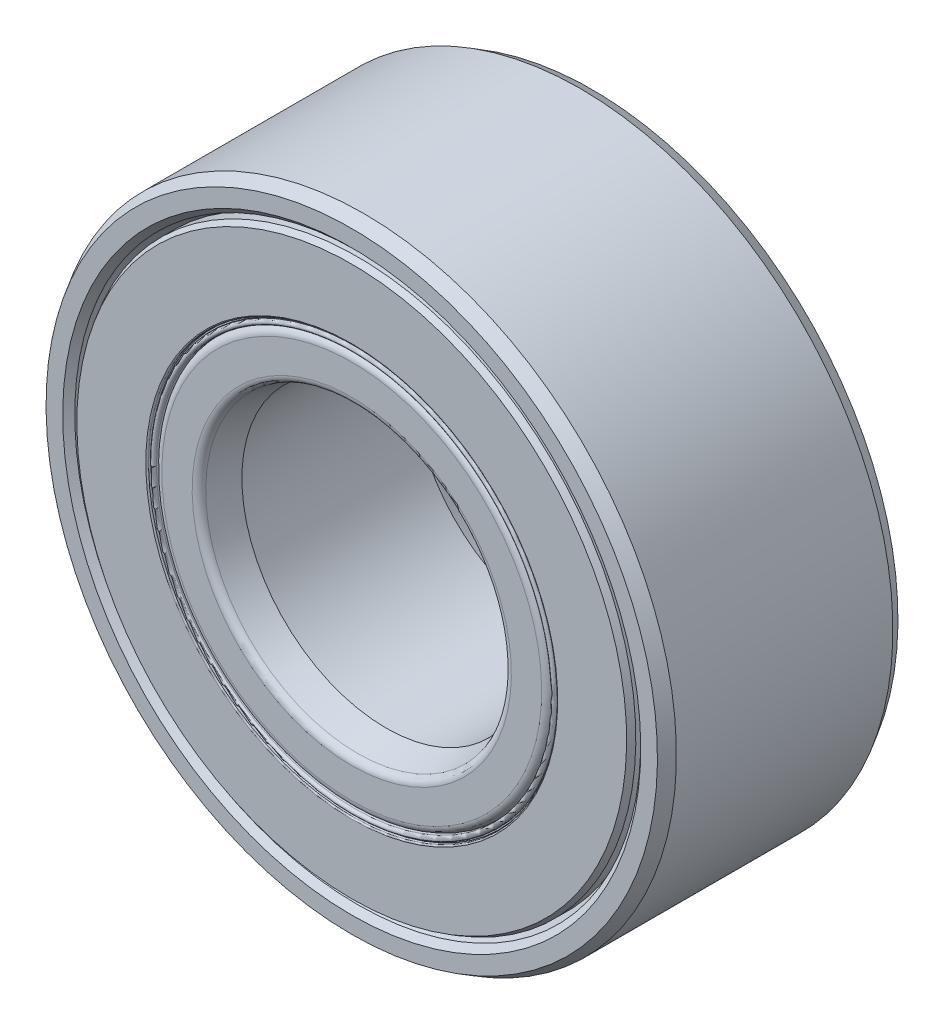
ISO-10303-21;
HEADER;
FILE_DESCRIPTION(('STEP AP214'),'2;1');
FILE_NAME('part.step','',(''),(''),'','','');
FILE_SCHEMA(('AUTOMOTIVE_DESIGN { 1 0 10303 214 1 1 1 1 }'));
ENDSEC;
DATA;
#1=APPLICATION_CONTEXT('core data for automotive mechanical design processes');
#2=APPLICATION_PROTOCOL_DEFINITION('international standard','automotive_design',2000,#1);
#3=PRODUCT_CONTEXT('',#1,'mechanical');
#4=PRODUCT('Part','Part','',(#3));
#5=PRODUCT_RELATED_PRODUCT_CATEGORY('part','',(#4));
#6=PRODUCT_DEFINITION_FORMATION('','',#4);
#7=PRODUCT_DEFINITION_CONTEXT('part definition',#1,'design');
#8=PRODUCT_DEFINITION('design','',#6,#7);
#9=PRODUCT_DEFINITION_SHAPE('','',#8);
#10=(LENGTH_UNIT() NAMED_UNIT(*) SI_UNIT(.MILLI.,.METRE.));
#11=(NAMED_UNIT(*) PLANE_ANGLE_UNIT() SI_UNIT($,.RADIAN.));
#12=(NAMED_UNIT(*) SI_UNIT($,.STERADIAN.) SOLID_ANGLE_UNIT());
#13=UNCERTAINTY_MEASURE_WITH_UNIT(LENGTH_MEASURE(1.E-05),#10,'distance_accuracy_value','');
#14=(GEOMETRIC_REPRESENTATION_CONTEXT(3) GLOBAL_UNCERTAINTY_ASSIGNED_CONTEXT((#13)) GLOBAL_UNIT_ASSIGNED_CONTEXT((#10,
#11,#12)) REPRESENTATION_CONTEXT('',''));
#15=CARTESIAN_POINT('',(0.,0.,0.));
#16=DIRECTION('',(0.,0.,1.));
#17=DIRECTION('',(1.,0.,0.));
#18=AXIS2_PLACEMENT_3D('',#15,#16,#17);
#19=CARTESIAN_POINT('',(0.,4.11333333333333,1.3125));
#20=DIRECTION('',(0.,0.,1.));
#21=DIRECTION('',(0.,-1.,0.));
#22=AXIS2_PLACEMENT_3D('',#19,#20,#21);
#23=PLANE('',#22);
#24=CARTESIAN_POINT('',(0.,0.,1.3125));
#25=DIRECTION('',(0.,0.,1.));
#26=DIRECTION('',(0.,-1.,0.));
#27=AXIS2_PLACEMENT_3D('',#24,#25,#26);
#28=CIRCLE('',#27,4.25333333333333);
#29=CARTESIAN_POINT('',(0.,-4.25333333333333,1.3125));
#30=VERTEX_POINT('',#29);
#31=EDGE_CURVE('E11',#30,#30,#28,.T.);
#32=ORIENTED_EDGE('',*,*,#31,.F.);
#33=EDGE_LOOP('',(#32));
#34=FACE_BOUND('',#33,.T.);
#35=CARTESIAN_POINT('',(0.,0.,1.3125));
#36=DIRECTION('',(0.,0.,1.));
#37=DIRECTION('',(0.,-1.,0.));
#38=AXIS2_PLACEMENT_3D('',#35,#36,#37);
#39=CIRCLE('',#38,4.11333333333333);
#40=CARTESIAN_POINT('',(0.,-4.11333333333333,1.3125));
#41=VERTEX_POINT('',#40);
#42=EDGE_CURVE('E71',#41,#41,#39,.T.);
#43=ORIENTED_EDGE('',*,*,#42,.T.);
#44=EDGE_LOOP('',(#43));
#45=FACE_BOUND('',#44,.T.);
#46=ADVANCED_FACE('F46',(#34,#45),#23,.F.);
#47=CARTESIAN_POINT('',(0.,0.,2.5));
#48=DIRECTION('',(0.,0.,1.));
#49=DIRECTION('',(0.,-1.,0.));
#50=AXIS2_PLACEMENT_3D('',#47,#48,#49);
#51=CYLINDRICAL_SURFACE('',#50,4.25333333333333);
#52=CARTESIAN_POINT('',(0.,0.,2.39056210322341));
#53=DIRECTION('',(0.,0.,1.));
#54=DIRECTION('',(0.,-1.,0.));
#55=AXIS2_PLACEMENT_3D('',#52,#53,#54);
#56=CIRCLE('',#55,4.25333333333333);
#57=CARTESIAN_POINT('',(0.,-4.25333333333333,2.39056210322341));
#58=VERTEX_POINT('',#57);
#59=EDGE_CURVE('E52',#58,#58,#56,.T.);
#60=ORIENTED_EDGE('',*,*,#59,.F.);
#61=EDGE_LOOP('',(#60));
#62=FACE_BOUND('',#61,.T.);
#63=ORIENTED_EDGE('',*,*,#31,.T.);
#64=EDGE_LOOP('',(#63));
#65=FACE_BOUND('',#64,.T.);
#66=ADVANCED_FACE('F102',(#62,#65),#51,.T.);
#67=CARTESIAN_POINT('',(0.,0.,2.39056210322341));
#68=DIRECTION('',(0.,0.,-1.));
#69=DIRECTION('',(0.,1.,0.));
#70=AXIS2_PLACEMENT_3D('',#67,#68,#69);
#71=CONICAL_SURFACE('',#70,4.25333333333333,0.174532925199437);
#72=CARTESIAN_POINT('',(0.,0.,2.42503037457884));
#73=DIRECTION('',(0.,0.,1.));
#74=DIRECTION('',(0.,-1.,0.));
#75=AXIS2_PLACEMENT_3D('',#72,#73,#74);
#76=CIRCLE('',#75,4.24725564711499);
#77=CARTESIAN_POINT('',(0.,-4.24725564711499,2.42503037457884));
#78=VERTEX_POINT('',#77);
#79=EDGE_CURVE('E56',#78,#78,#76,.T.);
#80=ORIENTED_EDGE('',*,*,#79,.F.);
#81=EDGE_LOOP('',(#80));
#82=FACE_BOUND('',#81,.T.);
#83=ORIENTED_EDGE('',*,*,#59,.T.);
#84=EDGE_LOOP('',(#83));
#85=FACE_BOUND('',#84,.T.);
#86=ADVANCED_FACE('F97',(#82,#85),#71,.T.);
#87=CARTESIAN_POINT('',(0.,0.,2.4225));
#88=DIRECTION('',(0.,0.,1.));
#89=DIRECTION('',(0.,-1.,0.));
#90=AXIS2_PLACEMENT_3D('',#87,#88,#89);
#91=TOROIDAL_SURFACE('',#90,4.23290517976922,0.0145718464358899);
#92=CARTESIAN_POINT('',(0.,0.,2.4225));
#93=DIRECTION('',(0.,0.,1.));
#94=DIRECTION('',(0.,-1.,0.));
#95=AXIS2_PLACEMENT_3D('',#92,#93,#94);
#96=CIRCLE('',#95,4.21833333333333);
#97=CARTESIAN_POINT('',(0.,-4.21833333333333,2.4225));
#98=VERTEX_POINT('',#97);
#99=EDGE_CURVE('E60',#98,#98,#96,.T.);
#100=ORIENTED_EDGE('',*,*,#99,.F.);
#101=EDGE_LOOP('',(#100));
#102=FACE_BOUND('',#101,.T.);
#103=ORIENTED_EDGE('',*,*,#79,.T.);
#104=EDGE_LOOP('',(#103));
#105=FACE_BOUND('',#104,.T.);
#106=ADVANCED_FACE('F91',(#102,#105),#91,.T.);
#107=CARTESIAN_POINT('',(0.,0.,2.5));
#108=DIRECTION('',(0.,0.,1.));
#109=DIRECTION('',(0.,-1.,0.));
#110=AXIS2_PLACEMENT_3D('',#107,#108,#109);
#111=CYLINDRICAL_SURFACE('',#110,4.21833333333333);
#112=CARTESIAN_POINT('',(0.,0.,2.4475));
#113=DIRECTION('',(0.,0.,1.));
#114=DIRECTION('',(0.,-1.,0.));
#115=AXIS2_PLACEMENT_3D('',#112,#113,#114);
#116=CIRCLE('',#115,4.21833333333333);
#117=CARTESIAN_POINT('',(0.,-4.21833333333333,2.4475));
#118=VERTEX_POINT('',#117);
#119=EDGE_CURVE('E65',#118,#118,#116,.T.);
#120=ORIENTED_EDGE('',*,*,#119,.F.);
#121=EDGE_LOOP('',(#120));
#122=FACE_BOUND('',#121,.T.);
#123=ORIENTED_EDGE('',*,*,#99,.T.);
#124=EDGE_LOOP('',(#123));
#125=FACE_BOUND('',#124,.T.);
#126=ADVANCED_FACE('F85',(#122,#125),#111,.T.);
#127=CARTESIAN_POINT('',(0.,0.,2.4475));
#128=DIRECTION('',(0.,0.,1.));
#129=DIRECTION('',(0.,-1.,0.));
#130=AXIS2_PLACEMENT_3D('',#127,#128,#129);
#131=TOROIDAL_SURFACE('',#130,4.16583333333333,0.0525000000000009);
#132=CARTESIAN_POINT('',(0.,0.,2.4475));
#133=DIRECTION('',(0.,0.,1.));
#134=DIRECTION('',(0.,-1.,0.));
#135=AXIS2_PLACEMENT_3D('',#132,#133,#134);
#136=CIRCLE('',#135,4.11333333333333);
#137=CARTESIAN_POINT('',(0.,-4.11333333333333,2.4475));
#138=VERTEX_POINT('',#137);
#139=EDGE_CURVE('E68',#138,#138,#136,.T.);
#140=ORIENTED_EDGE('',*,*,#139,.F.);
#141=EDGE_LOOP('',(#140));
#142=FACE_BOUND('',#141,.T.);
#143=ORIENTED_EDGE('',*,*,#119,.T.);
#144=EDGE_LOOP('',(#143));
#145=FACE_BOUND('',#144,.T.);
#146=ADVANCED_FACE('F79',(#142,#145),#131,.T.);
#147=CARTESIAN_POINT('',(0.,0.,2.5));
#148=DIRECTION('',(0.,0.,1.));
#149=DIRECTION('',(0.,-1.,0.));
#150=AXIS2_PLACEMENT_3D('',#147,#148,#149);
#151=CYLINDRICAL_SURFACE('',#150,4.11333333333333);
#152=ORIENTED_EDGE('',*,*,#42,.F.);
#153=EDGE_LOOP('',(#152));
#154=FACE_BOUND('',#153,.T.);
#155=ORIENTED_EDGE('',*,*,#139,.T.);
#156=EDGE_LOOP('',(#155));
#157=FACE_BOUND('',#156,.T.);
#158=ADVANCED_FACE('F76',(#154,#157),#151,.F.);
#159=CLOSED_SHELL('',(#46,#66,#86,#106,#126,#146,#158));
#160=MANIFOLD_SOLID_BREP('B2',#159);
#161=CARTESIAN_POINT('',(0.,0.,-2.50000000000001));
#162=DIRECTION('',(0.,0.,1.));
#163=DIRECTION('',(0.,-1.,0.));
#164=AXIS2_PLACEMENT_3D('',#161,#162,#163);
#165=CONICAL_SURFACE('',#164,5.715,0.523598775598297);
#166=CARTESIAN_POINT('',(0.,0.,-2.37875644347019));
#167=DIRECTION('',(0.,0.,1.));
#168=DIRECTION('',(0.,-1.,0.));
#169=AXIS2_PLACEMENT_3D('',#166,#167,#168);
#170=CIRCLE('',#169,5.785);
#171=CARTESIAN_POINT('',(0.,-5.785,-2.37875644347019));
#172=VERTEX_POINT('',#171);
#173=EDGE_CURVE('E169',#172,#172,#170,.T.);
#174=ORIENTED_EDGE('',*,*,#173,.F.);
#175=EDGE_LOOP('',(#174));
#176=FACE_BOUND('',#175,.T.);
#177=CARTESIAN_POINT('',(0.,0.,-2.50000000000001));
#178=DIRECTION('',(0.,0.,1.));
#179=DIRECTION('',(0.,-1.,0.));
#180=AXIS2_PLACEMENT_3D('',#177,#178,#179);
#181=CIRCLE('',#180,5.715);
#182=CARTESIAN_POINT('',(0.,-5.715,-2.50000000000001));
#183=VERTEX_POINT('',#182);
#184=EDGE_CURVE('E45',#183,#183,#181,.T.);
#185=ORIENTED_EDGE('',*,*,#184,.T.);
#186=EDGE_LOOP('',(#185));
#187=FACE_BOUND('',#186,.T.);
#188=ADVANCED_FACE('F147',(#176,#187),#165,.T.);
#189=CARTESIAN_POINT('',(0.,5.715,-2.50000000000001));
#190=DIRECTION('',(0.,0.,1.));
#191=DIRECTION('',(0.,-1.,0.));
#192=AXIS2_PLACEMENT_3D('',#189,#190,#191);
#193=PLANE('',#192);
#194=ORIENTED_EDGE('',*,*,#184,.F.);
#195=EDGE_LOOP('',(#194));
#196=FACE_BOUND('',#195,.T.);
#197=CARTESIAN_POINT('',(0.,0.,-2.50000000000001));
#198=DIRECTION('',(0.,0.,1.));
#199=DIRECTION('',(0.,-1.,0.));
#200=AXIS2_PLACEMENT_3D('',#197,#198,#199);
#201=CIRCLE('',#200,4.28133333333333);
#202=CARTESIAN_POINT('',(0.,-4.28133333333333,-2.50000000000001));
#203=VERTEX_POINT('',#202);
#204=EDGE_CURVE('E153',#203,#203,#201,.T.);
#205=ORIENTED_EDGE('',*,*,#204,.T.);
#206=EDGE_LOOP('',(#205));
#207=FACE_BOUND('',#206,.T.);
#208=ADVANCED_FACE('F176',(#196,#207),#193,.F.);
#209=CARTESIAN_POINT('',(0.,0.,-2.47200000000001));
#210=DIRECTION('',(0.,0.,1.));
#211=DIRECTION('',(0.,-1.,0.));
#212=AXIS2_PLACEMENT_3D('',#209,#210,#211);
#213=TOROIDAL_SURFACE('',#212,4.28133333333333,0.028);
#214=ORIENTED_EDGE('',*,*,#204,.F.);
#215=EDGE_LOOP('',(#214));
#216=FACE_BOUND('',#215,.T.);
#217=CARTESIAN_POINT('',(0.,0.,-2.47200000000001));
#218=DIRECTION('',(0.,0.,1.));
#219=DIRECTION('',(0.,-1.,0.));
#220=AXIS2_PLACEMENT_3D('',#217,#218,#219);
#221=CIRCLE('',#220,4.25333333333333);
#222=CARTESIAN_POINT('',(0.,-4.25333333333333,-2.47200000000001));
#223=VERTEX_POINT('',#222);
#224=EDGE_CURVE('E157',#223,#223,#221,.T.);
#225=ORIENTED_EDGE('',*,*,#224,.T.);
#226=EDGE_LOOP('',(#225));
#227=FACE_BOUND('',#226,.T.);
#228=ADVANCED_FACE('F180',(#216,#227),#213,.T.);
#229=CARTESIAN_POINT('',(0.,0.,2.5));
#230=DIRECTION('',(0.,0.,1.));
#231=DIRECTION('',(0.,-1.,0.));
#232=AXIS2_PLACEMENT_3D('',#229,#230,#231);
#233=CYLINDRICAL_SURFACE('',#232,4.25333333333333);
#234=ORIENTED_EDGE('',*,*,#224,.F.);
#235=EDGE_LOOP('',(#234));
#236=FACE_BOUND('',#235,.T.);
#237=CARTESIAN_POINT('',(0.,0.,-1.3125));
#238=DIRECTION('',(0.,0.,1.));
#239=DIRECTION('',(0.,-1.,0.));
#240=AXIS2_PLACEMENT_3D('',#237,#238,#239);
#241=CIRCLE('',#240,4.25333333333333);
#242=CARTESIAN_POINT('',(0.,-4.25333333333333,-1.3125));
#243=VERTEX_POINT('',#242);
#244=EDGE_CURVE('E161',#243,#243,#241,.T.);
#245=ORIENTED_EDGE('',*,*,#244,.T.);
#246=EDGE_LOOP('',(#245));
#247=FACE_BOUND('',#246,.T.);
#248=ADVANCED_FACE('F185',(#236,#247),#233,.F.);
#249=CARTESIAN_POINT('',(0.,5.785,-1.3125));
#250=DIRECTION('',(0.,0.,-1.));
#251=DIRECTION('',(0.,1.,0.));
#252=AXIS2_PLACEMENT_3D('',#249,#250,#251);
#253=PLANE('',#252);
#254=ORIENTED_EDGE('',*,*,#244,.F.);
#255=EDGE_LOOP('',(#254));
#256=FACE_BOUND('',#255,.T.);
#257=CARTESIAN_POINT('',(0.,0.,-1.3125));
#258=DIRECTION('',(0.,0.,1.));
#259=DIRECTION('',(0.,-1.,0.));
#260=AXIS2_PLACEMENT_3D('',#257,#258,#259);
#261=CIRCLE('',#260,5.785);
#262=CARTESIAN_POINT('',(0.,-5.785,-1.3125));
#263=VERTEX_POINT('',#262);
#264=EDGE_CURVE('E166',#263,#263,#261,.T.);
#265=ORIENTED_EDGE('',*,*,#264,.T.);
#266=EDGE_LOOP('',(#265));
#267=FACE_BOUND('',#266,.T.);
#268=ADVANCED_FACE('F191',(#256,#267),#253,.F.);
#269=CARTESIAN_POINT('',(0.,0.,2.5));
#270=DIRECTION('',(0.,0.,1.));
#271=DIRECTION('',(0.,-1.,0.));
#272=AXIS2_PLACEMENT_3D('',#269,#270,#271);
#273=CYLINDRICAL_SURFACE('',#272,5.785);
#274=ORIENTED_EDGE('',*,*,#264,.F.);
#275=EDGE_LOOP('',(#274));
#276=FACE_BOUND('',#275,.T.);
#277=ORIENTED_EDGE('',*,*,#173,.T.);
#278=EDGE_LOOP('',(#277));
#279=FACE_BOUND('',#278,.T.);
#280=ADVANCED_FACE('F173',(#276,#279),#273,.T.);
#281=CLOSED_SHELL('',(#188,#208,#228,#248,#268,#280));
#282=MANIFOLD_SOLID_BREP('B6',#281);
#283=CARTESIAN_POINT('',(0.,5.785,1.3125));
#284=DIRECTION('',(0.,0.,1.));
#285=DIRECTION('',(0.,-1.,0.));
#286=AXIS2_PLACEMENT_3D('',#283,#284,#285);
#287=PLANE('',#286);
#288=CARTESIAN_POINT('',(0.,0.,1.3125));
#289=DIRECTION('',(0.,0.,1.));
#290=DIRECTION('',(0.,-1.,0.));
#291=AXIS2_PLACEMENT_3D('',#288,#289,#290);
#292=CIRCLE('',#291,5.785);
#293=CARTESIAN_POINT('',(0.,-5.785,1.3125));
#294=VERTEX_POINT('',#293);
#295=EDGE_CURVE('E146',#294,#294,#292,.T.);
#296=ORIENTED_EDGE('',*,*,#295,.F.);
#297=EDGE_LOOP('',(#296));
#298=FACE_BOUND('',#297,.T.);
#299=CARTESIAN_POINT('',(0.,0.,1.3125));
#300=DIRECTION('',(0.,0.,1.));
#301=DIRECTION('',(0.,-1.,0.));
#302=AXIS2_PLACEMENT_3D('',#299,#300,#301);
#303=CIRCLE('',#302,4.25333333333333);
#304=CARTESIAN_POINT('',(0.,-4.25333333333333,1.3125));
#305=VERTEX_POINT('',#304);
#306=EDGE_CURVE('E255',#305,#305,#303,.T.);
#307=ORIENTED_EDGE('',*,*,#306,.T.);
#308=EDGE_LOOP('',(#307));
#309=FACE_BOUND('',#308,.T.);
#310=ADVANCED_FACE('F233',(#298,#309),#287,.F.);
#311=CARTESIAN_POINT('',(0.,0.,2.5));
#312=DIRECTION('',(0.,0.,1.));
#313=DIRECTION('',(0.,-1.,0.));
#314=AXIS2_PLACEMENT_3D('',#311,#312,#313);
#315=CYLINDRICAL_SURFACE('',#314,5.785);
#316=CARTESIAN_POINT('',(0.,0.,2.37875644347018));
#317=DIRECTION('',(0.,0.,1.));
#318=DIRECTION('',(0.,-1.,0.));
#319=AXIS2_PLACEMENT_3D('',#316,#317,#318);
#320=CIRCLE('',#319,5.785);
#321=CARTESIAN_POINT('',(0.,-5.785,2.37875644347018));
#322=VERTEX_POINT('',#321);
#323=EDGE_CURVE('E239',#322,#322,#320,.T.);
#324=ORIENTED_EDGE('',*,*,#323,.F.);
#325=EDGE_LOOP('',(#324));
#326=FACE_BOUND('',#325,.T.);
#327=ORIENTED_EDGE('',*,*,#295,.T.);
#328=EDGE_LOOP('',(#327));
#329=FACE_BOUND('',#328,.T.);
#330=ADVANCED_FACE('F280',(#326,#329),#315,.T.);
#331=CARTESIAN_POINT('',(0.,0.,2.37875644347018));
#332=DIRECTION('',(0.,0.,-1.));
#333=DIRECTION('',(0.,1.,0.));
#334=AXIS2_PLACEMENT_3D('',#331,#332,#333);
#335=CONICAL_SURFACE('',#334,5.785,0.523598775598299);
#336=CARTESIAN_POINT('',(0.,0.,2.5));
#337=DIRECTION('',(0.,0.,1.));
#338=DIRECTION('',(0.,-1.,0.));
#339=AXIS2_PLACEMENT_3D('',#336,#337,#338);
#340=CIRCLE('',#339,5.715);
#341=CARTESIAN_POINT('',(0.,-5.715,2.5));
#342=VERTEX_POINT('',#341);
#343=EDGE_CURVE('E243',#342,#342,#340,.T.);
#344=ORIENTED_EDGE('',*,*,#343,.F.);
#345=EDGE_LOOP('',(#344));
#346=FACE_BOUND('',#345,.T.);
#347=ORIENTED_EDGE('',*,*,#323,.T.);
#348=EDGE_LOOP('',(#347));
#349=FACE_BOUND('',#348,.T.);
#350=ADVANCED_FACE('F275',(#346,#349),#335,.T.);
#351=CARTESIAN_POINT('',(0.,5.715,2.5));
#352=DIRECTION('',(0.,0.,-1.));
#353=DIRECTION('',(0.,1.,0.));
#354=AXIS2_PLACEMENT_3D('',#351,#352,#353);
#355=PLANE('',#354);
#356=CARTESIAN_POINT('',(0.,0.,2.5));
#357=DIRECTION('',(0.,0.,1.));
#358=DIRECTION('',(0.,-1.,0.));
#359=AXIS2_PLACEMENT_3D('',#356,#357,#358);
#360=CIRCLE('',#359,4.28133333333333);
#361=CARTESIAN_POINT('',(0.,-4.28133333333333,2.5));
#362=VERTEX_POINT('',#361);
#363=EDGE_CURVE('E247',#362,#362,#360,.T.);
#364=ORIENTED_EDGE('',*,*,#363,.F.);
#365=EDGE_LOOP('',(#364));
#366=FACE_BOUND('',#365,.T.);
#367=ORIENTED_EDGE('',*,*,#343,.T.);
#368=EDGE_LOOP('',(#367));
#369=FACE_BOUND('',#368,.T.);
#370=ADVANCED_FACE('F269',(#366,#369),#355,.F.);
#371=CARTESIAN_POINT('',(0.,0.,2.472));
#372=DIRECTION('',(0.,0.,1.));
#373=DIRECTION('',(0.,-1.,0.));
#374=AXIS2_PLACEMENT_3D('',#371,#372,#373);
#375=TOROIDAL_SURFACE('',#374,4.28133333333333,0.028);
#376=CARTESIAN_POINT('',(0.,0.,2.472));
#377=DIRECTION('',(0.,0.,1.));
#378=DIRECTION('',(0.,-1.,0.));
#379=AXIS2_PLACEMENT_3D('',#376,#377,#378);
#380=CIRCLE('',#379,4.25333333333333);
#381=CARTESIAN_POINT('',(0.,-4.25333333333333,2.472));
#382=VERTEX_POINT('',#381);
#383=EDGE_CURVE('E252',#382,#382,#380,.T.);
#384=ORIENTED_EDGE('',*,*,#383,.F.);
#385=EDGE_LOOP('',(#384));
#386=FACE_BOUND('',#385,.T.);
#387=ORIENTED_EDGE('',*,*,#363,.T.);
#388=EDGE_LOOP('',(#387));
#389=FACE_BOUND('',#388,.T.);
#390=ADVANCED_FACE('F263',(#386,#389),#375,.T.);
#391=CARTESIAN_POINT('',(0.,0.,2.5));
#392=DIRECTION('',(0.,0.,1.));
#393=DIRECTION('',(0.,-1.,0.));
#394=AXIS2_PLACEMENT_3D('',#391,#392,#393);
#395=CYLINDRICAL_SURFACE('',#394,4.25333333333333);
#396=ORIENTED_EDGE('',*,*,#306,.F.);
#397=EDGE_LOOP('',(#396));
#398=FACE_BOUND('',#397,.T.);
#399=ORIENTED_EDGE('',*,*,#383,.T.);
#400=EDGE_LOOP('',(#399));
#401=FACE_BOUND('',#400,.T.);
#402=ADVANCED_FACE('F260',(#398,#401),#395,.F.);
#403=CLOSED_SHELL('',(#310,#330,#350,#370,#390,#402));
#404=MANIFOLD_SOLID_BREP('B40',#403);
#405=CARTESIAN_POINT('',(-3.18126301160692,3.79128162306971,0.));
#406=DIRECTION('',(0.,0.,1.));
#407=DIRECTION('',(-0.64278760968653,0.766044443118986,0.));
#408=AXIS2_PLACEMENT_3D('',#405,#406,#407);
#409=SPHERICAL_SURFACE('',#408,1.3125);
#410=CARTESIAN_POINT('',(-3.18126301160692,3.79128162306971,1.3125));
#411=VERTEX_POINT('',#410);
#412=VERTEX_LOOP('',#411);
#413=FACE_BOUND('',#412,.T.);
#414=ADVANCED_FACE('F337',(#413),#409,.T.);
#415=CLOSED_SHELL('',(#414));
#416=MANIFOLD_SOLID_BREP('B141',#415);
#417=CARTESIAN_POINT('',(-4.87397770428291,0.859413772636633,0.));
#418=DIRECTION('',(0.,0.,1.));
#419=DIRECTION('',(-0.984807753012206,0.17364817766694,0.));
#420=AXIS2_PLACEMENT_3D('',#417,#418,#419);
#421=SPHERICAL_SURFACE('',#420,1.3125);
#422=CARTESIAN_POINT('',(-4.87397770428291,0.859413772636632,1.3125));
#423=VERTEX_POINT('',#422);
#424=VERTEX_LOOP('',#423);
#425=FACE_BOUND('',#424,.T.);
#426=ADVANCED_FACE('F354',(#425),#421,.T.);
#427=CLOSED_SHELL('',(#426));
#428=MANIFOLD_SOLID_BREP('B229',#427);
#429=CARTESIAN_POINT('',(-4.28610406089651,-2.47458333333329,0.));
#430=DIRECTION('',(0.,0.,1.));
#431=DIRECTION('',(-0.866025403784443,-0.499999999999992,0.));
#432=AXIS2_PLACEMENT_3D('',#429,#430,#431);
#433=SPHERICAL_SURFACE('',#432,1.3125);
#434=CARTESIAN_POINT('',(-4.28610406089651,-2.47458333333329,1.3125));
#435=VERTEX_POINT('',#434);
#436=VERTEX_LOOP('',#435);
#437=FACE_BOUND('',#436,.T.);
#438=ADVANCED_FACE('F371',(#437),#433,.T.);
#439=CLOSED_SHELL('',(#438));
#440=MANIFOLD_SOLID_BREP('B333',#439);
#441=CARTESIAN_POINT('',(-1.69271469267599,-4.65069539570625,0.));
#442=DIRECTION('',(0.,0.,1.));
#443=DIRECTION('',(-0.342020143325676,-0.939692620785906,0.));
#444=AXIS2_PLACEMENT_3D('',#441,#442,#443);
#445=SPHERICAL_SURFACE('',#444,1.3125);
#446=CARTESIAN_POINT('',(-1.69271469267599,-4.65069539570625,1.3125));
#447=VERTEX_POINT('',#446);
#448=VERTEX_LOOP('',#447);
#449=FACE_BOUND('',#448,.T.);
#450=ADVANCED_FACE('F388',(#449),#445,.T.);
#451=CLOSED_SHELL('',(#450));
#452=MANIFOLD_SOLID_BREP('B350',#451);
#453=CARTESIAN_POINT('',(1.69271469267593,-4.65069539570627,0.));
#454=DIRECTION('',(0.,0.,1.));
#455=DIRECTION('',(0.342020143325663,-0.939692620785911,0.));
#456=AXIS2_PLACEMENT_3D('',#453,#454,#455);
#457=SPHERICAL_SURFACE('',#456,1.3125);
#458=CARTESIAN_POINT('',(1.69271469267593,-4.65069539570627,1.3125));
#459=VERTEX_POINT('',#458);
#460=VERTEX_LOOP('',#459);
#461=FACE_BOUND('',#460,.T.);
#462=ADVANCED_FACE('F405',(#461),#457,.T.);
#463=CLOSED_SHELL('',(#462));
#464=MANIFOLD_SOLID_BREP('B367',#463);
#465=CARTESIAN_POINT('',(4.28610406089647,-2.47458333333335,0.));
#466=DIRECTION('',(0.,0.,1.));
#467=DIRECTION('',(0.866025403784436,-0.500000000000004,0.));
#468=AXIS2_PLACEMENT_3D('',#465,#466,#467);
#469=SPHERICAL_SURFACE('',#468,1.3125);
#470=CARTESIAN_POINT('',(4.28610406089647,-2.47458333333335,1.3125));
#471=VERTEX_POINT('',#470);
#472=VERTEX_LOOP('',#471);
#473=FACE_BOUND('',#472,.T.);
#474=ADVANCED_FACE('F422',(#473),#469,.T.);
#475=CLOSED_SHELL('',(#474));
#476=MANIFOLD_SOLID_BREP('B384',#475);
#477=CARTESIAN_POINT('',(4.87397770428292,0.859413772636568,0.));
#478=DIRECTION('',(0.,0.,1.));
#479=DIRECTION('',(0.984807753012209,0.173648177666927,0.));
#480=AXIS2_PLACEMENT_3D('',#477,#478,#479);
#481=SPHERICAL_SURFACE('',#480,1.3125);
#482=CARTESIAN_POINT('',(4.87397770428292,0.859413772636568,1.3125));
#483=VERTEX_POINT('',#482);
#484=VERTEX_LOOP('',#483);
#485=FACE_BOUND('',#484,.T.);
#486=ADVANCED_FACE('F439',(#485),#481,.T.);
#487=CLOSED_SHELL('',(#486));
#488=MANIFOLD_SOLID_BREP('B401',#487);
#489=CARTESIAN_POINT('',(3.18126301160697,3.79128162306967,0.));
#490=DIRECTION('',(0.,0.,1.));
#491=DIRECTION('',(0.642787609686541,0.766044443118977,0.));
#492=AXIS2_PLACEMENT_3D('',#489,#490,#491);
#493=SPHERICAL_SURFACE('',#492,1.3125);
#494=CARTESIAN_POINT('',(3.18126301160697,3.79128162306967,1.3125));
#495=VERTEX_POINT('',#494);
#496=VERTEX_LOOP('',#495);
#497=FACE_BOUND('',#496,.T.);
#498=ADVANCED_FACE('F456',(#497),#493,.T.);
#499=CLOSED_SHELL('',(#498));
#500=MANIFOLD_SOLID_BREP('B418',#499);
#501=CARTESIAN_POINT('',(0.,4.94916666666667,0.));
#502=DIRECTION('',(0.,0.,1.));
#503=DIRECTION('',(0.,1.,0.));
#504=AXIS2_PLACEMENT_3D('',#501,#502,#503);
#505=SPHERICAL_SURFACE('',#504,1.3125);
#506=CARTESIAN_POINT('',(0.,4.94916666666667,1.3125));
#507=VERTEX_POINT('',#506);
#508=VERTEX_LOOP('',#507);
#509=FACE_BOUND('',#508,.T.);
#510=ADVANCED_FACE('F475',(#509),#505,.T.);
#511=CLOSED_SHELL('',(#510));
#512=MANIFOLD_SOLID_BREP('B435',#511);
#513=CARTESIAN_POINT('',(0.,0.,-2.33521854128473));
#514=DIRECTION('',(0.,0.,1.));
#515=DIRECTION('',(0.,-1.,0.));
#516=AXIS2_PLACEMENT_3D('',#513,#514,#515);
#517=TOROIDAL_SURFACE('',#516,3.31833333333333,0.164781458715271);
#518=CARTESIAN_POINT('',(0.,0.,-2.50000000000001));
#519=DIRECTION('',(0.,0.,1.));
#520=DIRECTION('',(0.,-1.,0.));
#521=AXIS2_PLACEMENT_3D('',#518,#519,#520);
#522=CIRCLE('',#521,3.31833333333333);
#523=CARTESIAN_POINT('',(0.,-3.31833333333333,-2.50000000000001));
#524=VERTEX_POINT('',#523);
#525=EDGE_CURVE('E474',#524,#524,#522,.T.);
#526=ORIENTED_EDGE('',*,*,#525,.F.);
#527=EDGE_LOOP('',(#526));
#528=FACE_BOUND('',#527,.T.);
#529=CARTESIAN_POINT('',(0.,0.,-2.37786712108002));
#530=DIRECTION('',(0.,0.,1.));
#531=DIRECTION('',(0.,-1.,0.));
#532=AXIS2_PLACEMENT_3D('',#529,#530,#531);
#533=CIRCLE('',#532,3.15916666666667);
#534=CARTESIAN_POINT('',(0.,-3.15916666666667,-2.37786712108002));
#535=VERTEX_POINT('',#534);
#536=EDGE_CURVE('E533',#535,#535,#533,.T.);
#537=ORIENTED_EDGE('',*,*,#536,.T.);
#538=EDGE_LOOP('',(#537));
#539=FACE_BOUND('',#538,.T.);
#540=ADVANCED_FACE('F493',(#528,#539),#517,.T.);
#541=CARTESIAN_POINT('',(0.,3.31833333333333,-2.5));
#542=DIRECTION('',(0.,0.,1.));
#543=DIRECTION('',(0.,-1.,0.));
#544=AXIS2_PLACEMENT_3D('',#541,#542,#543);
#545=PLANE('',#544);
#546=CARTESIAN_POINT('',(0.,0.,-2.5));
#547=DIRECTION('',(0.,0.,1.));
#548=DIRECTION('',(0.,-1.,0.));
#549=AXIS2_PLACEMENT_3D('',#546,#547,#548);
#550=CIRCLE('',#549,3.94855187461806);
#551=CARTESIAN_POINT('',(0.,-3.94855187461806,-2.5));
#552=VERTEX_POINT('',#551);
#553=EDGE_CURVE('E499',#552,#552,#550,.T.);
#554=ORIENTED_EDGE('',*,*,#553,.F.);
#555=EDGE_LOOP('',(#554));
#556=FACE_BOUND('',#555,.T.);
#557=ORIENTED_EDGE('',*,*,#525,.T.);
#558=EDGE_LOOP('',(#557));
#559=FACE_BOUND('',#558,.T.);
#560=ADVANCED_FACE('F594',(#556,#559),#545,.F.);
#561=CARTESIAN_POINT('',(0.,0.,-2.33521854128473));
#562=DIRECTION('',(0.,0.,1.));
#563=DIRECTION('',(0.,-1.,0.));
#564=AXIS2_PLACEMENT_3D('',#561,#562,#563);
#565=TOROIDAL_SURFACE('',#564,3.94855187461806,0.164781458715271);
#566=CARTESIAN_POINT('',(0.,0.,-2.33521854128473));
#567=DIRECTION('',(0.,0.,1.));
#568=DIRECTION('',(0.,-1.,0.));
#569=AXIS2_PLACEMENT_3D('',#566,#567,#568);
#570=CIRCLE('',#569,4.11333333333333);
#571=CARTESIAN_POINT('',(0.,-4.11333333333333,-2.33521854128473));
#572=VERTEX_POINT('',#571);
#573=EDGE_CURVE('E503',#572,#572,#570,.T.);
#574=ORIENTED_EDGE('',*,*,#573,.F.);
#575=EDGE_LOOP('',(#574));
#576=FACE_BOUND('',#575,.T.);
#577=ORIENTED_EDGE('',*,*,#553,.T.);
#578=EDGE_LOOP('',(#577));
#579=FACE_BOUND('',#578,.T.);
#580=ADVANCED_FACE('F589',(#576,#579),#565,.T.);
#581=CARTESIAN_POINT('',(0.,0.,2.5));
#582=DIRECTION('',(0.,0.,1.));
#583=DIRECTION('',(0.,-1.,0.));
#584=AXIS2_PLACEMENT_3D('',#581,#582,#583);
#585=CYLINDRICAL_SURFACE('',#584,4.11333333333333);
#586=CARTESIAN_POINT('',(0.,0.,-1.01194806630029));
#587=DIRECTION('',(0.,0.,1.));
#588=DIRECTION('',(0.,-1.,0.));
#589=AXIS2_PLACEMENT_3D('',#586,#587,#588);
#590=CIRCLE('',#589,4.11333333333333);
#591=CARTESIAN_POINT('',(0.,-4.11333333333333,-1.01194806630029));
#592=VERTEX_POINT('',#591);
#593=EDGE_CURVE('E507',#592,#592,#590,.T.);
#594=ORIENTED_EDGE('',*,*,#593,.F.);
#595=EDGE_LOOP('',(#594));
#596=FACE_BOUND('',#595,.T.);
#597=ORIENTED_EDGE('',*,*,#573,.T.);
#598=EDGE_LOOP('',(#597));
#599=FACE_BOUND('',#598,.T.);
#600=ADVANCED_FACE('F583',(#596,#599),#585,.T.);
#601=CARTESIAN_POINT('',(0.,0.,0.));
#602=DIRECTION('',(0.,0.,1.));
#603=DIRECTION('',(0.,-1.,0.));
#604=AXIS2_PLACEMENT_3D('',#601,#602,#603);
#605=TOROIDAL_SURFACE('',#604,4.94916666666666,1.3125);
#606=CARTESIAN_POINT('',(0.,0.,1.01194806630028));
#607=DIRECTION('',(0.,0.,1.));
#608=DIRECTION('',(0.,-1.,0.));
#609=AXIS2_PLACEMENT_3D('',#606,#607,#608);
#610=CIRCLE('',#609,4.11333333333333);
#611=CARTESIAN_POINT('',(0.,-4.11333333333333,1.01194806630028));
#612=VERTEX_POINT('',#611);
#613=EDGE_CURVE('E512',#612,#612,#610,.T.);
#614=ORIENTED_EDGE('',*,*,#613,.F.);
#615=EDGE_LOOP('',(#614));
#616=FACE_BOUND('',#615,.T.);
#617=ORIENTED_EDGE('',*,*,#593,.T.);
#618=EDGE_LOOP('',(#617));
#619=FACE_BOUND('',#618,.T.);
#620=ADVANCED_FACE('F577',(#616,#619),#605,.F.);
#621=CARTESIAN_POINT('',(0.,0.,2.5));
#622=DIRECTION('',(0.,0.,1.));
#623=DIRECTION('',(0.,-1.,0.));
#624=AXIS2_PLACEMENT_3D('',#621,#622,#623);
#625=CYLINDRICAL_SURFACE('',#624,4.11333333333333);
#626=CARTESIAN_POINT('',(0.,0.,2.33521854128473));
#627=DIRECTION('',(0.,0.,1.));
#628=DIRECTION('',(0.,-1.,0.));
#629=AXIS2_PLACEMENT_3D('',#626,#627,#628);
#630=CIRCLE('',#629,4.11333333333333);
#631=CARTESIAN_POINT('',(0.,-4.11333333333333,2.33521854128473));
#632=VERTEX_POINT('',#631);
#633=EDGE_CURVE('E515',#632,#632,#630,.T.);
#634=ORIENTED_EDGE('',*,*,#633,.F.);
#635=EDGE_LOOP('',(#634));
#636=FACE_BOUND('',#635,.T.);
#637=ORIENTED_EDGE('',*,*,#613,.T.);
#638=EDGE_LOOP('',(#637));
#639=FACE_BOUND('',#638,.T.);
#640=ADVANCED_FACE('F571',(#636,#639),#625,.T.);
#641=CARTESIAN_POINT('',(0.,0.,2.33521854128473));
#642=DIRECTION('',(0.,0.,1.));
#643=DIRECTION('',(0.,-1.,0.));
#644=AXIS2_PLACEMENT_3D('',#641,#642,#643);
#645=TOROIDAL_SURFACE('',#644,3.94855187461806,0.164781458715271);
#646=CARTESIAN_POINT('',(0.,0.,2.5));
#647=DIRECTION('',(0.,0.,1.));
#648=DIRECTION('',(0.,-1.,0.));
#649=AXIS2_PLACEMENT_3D('',#646,#647,#648);
#650=CIRCLE('',#649,3.94855187461806);
#651=CARTESIAN_POINT('',(0.,-3.94855187461806,2.5));
#652=VERTEX_POINT('',#651);
#653=EDGE_CURVE('E518',#652,#652,#650,.T.);
#654=ORIENTED_EDGE('',*,*,#653,.F.);
#655=EDGE_LOOP('',(#654));
#656=FACE_BOUND('',#655,.T.);
#657=ORIENTED_EDGE('',*,*,#633,.T.);
#658=EDGE_LOOP('',(#657));
#659=FACE_BOUND('',#658,.T.);
#660=ADVANCED_FACE('F565',(#656,#659),#645,.T.);
#661=CARTESIAN_POINT('',(0.,3.31833333333333,2.5));
#662=DIRECTION('',(0.,0.,-1.));
#663=DIRECTION('',(0.,1.,0.));
#664=AXIS2_PLACEMENT_3D('',#661,#662,#663);
#665=PLANE('',#664);
#666=CARTESIAN_POINT('',(0.,0.,2.5));
#667=DIRECTION('',(0.,0.,1.));
#668=DIRECTION('',(0.,-1.,0.));
#669=AXIS2_PLACEMENT_3D('',#666,#667,#668);
#670=CIRCLE('',#669,3.31833333333333);
#671=CARTESIAN_POINT('',(0.,-3.31833333333333,2.5));
#672=VERTEX_POINT('',#671);
#673=EDGE_CURVE('E521',#672,#672,#670,.T.);
#674=ORIENTED_EDGE('',*,*,#673,.F.);
#675=EDGE_LOOP('',(#674));
#676=FACE_BOUND('',#675,.T.);
#677=ORIENTED_EDGE('',*,*,#653,.T.);
#678=EDGE_LOOP('',(#677));
#679=FACE_BOUND('',#678,.T.);
#680=ADVANCED_FACE('F559',(#676,#679),#665,.F.);
#681=CARTESIAN_POINT('',(0.,0.,2.33521854128473));
#682=DIRECTION('',(0.,0.,1.));
#683=DIRECTION('',(0.,-1.,0.));
#684=AXIS2_PLACEMENT_3D('',#681,#682,#683);
#685=TOROIDAL_SURFACE('',#684,3.31833333333333,0.164781458715271);
#686=CARTESIAN_POINT('',(0.,0.,2.37786712108002));
#687=DIRECTION('',(0.,0.,1.));
#688=DIRECTION('',(0.,-1.,0.));
#689=AXIS2_PLACEMENT_3D('',#686,#687,#688);
#690=CIRCLE('',#689,3.15916666666667);
#691=CARTESIAN_POINT('',(0.,-3.15916666666667,2.37786712108002));
#692=VERTEX_POINT('',#691);
#693=EDGE_CURVE('E524',#692,#692,#690,.T.);
#694=ORIENTED_EDGE('',*,*,#693,.F.);
#695=EDGE_LOOP('',(#694));
#696=FACE_BOUND('',#695,.T.);
#697=ORIENTED_EDGE('',*,*,#673,.T.);
#698=EDGE_LOOP('',(#697));
#699=FACE_BOUND('',#698,.T.);
#700=ADVANCED_FACE('F553',(#696,#699),#685,.T.);
#701=CARTESIAN_POINT('',(0.,0.,2.37786712108002));
#702=DIRECTION('',(0.,0.,1.));
#703=DIRECTION('',(0.,-1.,0.));
#704=AXIS2_PLACEMENT_3D('',#701,#702,#703);
#705=CONICAL_SURFACE('',#704,3.15916666666667,0.261799387799152);
#706=CARTESIAN_POINT('',(0.,0.,1.78384903420864));
#707=DIRECTION('',(0.,0.,1.));
#708=DIRECTION('',(0.,-1.,0.));
#709=AXIS2_PLACEMENT_3D('',#706,#707,#708);
#710=CIRCLE('',#709,3.);
#711=CARTESIAN_POINT('',(0.,-3.,1.78384903420864));
#712=VERTEX_POINT('',#711);
#713=EDGE_CURVE('E527',#712,#712,#710,.T.);
#714=ORIENTED_EDGE('',*,*,#713,.F.);
#715=EDGE_LOOP('',(#714));
#716=FACE_BOUND('',#715,.T.);
#717=ORIENTED_EDGE('',*,*,#693,.T.);
#718=EDGE_LOOP('',(#717));
#719=FACE_BOUND('',#718,.T.);
#720=ADVANCED_FACE('F547',(#716,#719),#705,.F.);
#721=CARTESIAN_POINT('',(0.,0.,2.5));
#722=DIRECTION('',(0.,0.,1.));
#723=DIRECTION('',(0.,-1.,0.));
#724=AXIS2_PLACEMENT_3D('',#721,#722,#723);
#725=CYLINDRICAL_SURFACE('',#724,3.);
#726=CARTESIAN_POINT('',(0.,0.,-1.78384903420865));
#727=DIRECTION('',(0.,0.,1.));
#728=DIRECTION('',(0.,-1.,0.));
#729=AXIS2_PLACEMENT_3D('',#726,#727,#728);
#730=CIRCLE('',#729,3.);
#731=CARTESIAN_POINT('',(0.,-3.,-1.78384903420865));
#732=VERTEX_POINT('',#731);
#733=EDGE_CURVE('E530',#732,#732,#730,.T.);
#734=ORIENTED_EDGE('',*,*,#733,.F.);
#735=EDGE_LOOP('',(#734));
#736=FACE_BOUND('',#735,.T.);
#737=ORIENTED_EDGE('',*,*,#713,.T.);
#738=EDGE_LOOP('',(#737));
#739=FACE_BOUND('',#738,.T.);
#740=ADVANCED_FACE('F541',(#736,#739),#725,.F.);
#741=CARTESIAN_POINT('',(0.,0.,-1.78384903420865));
#742=DIRECTION('',(0.,0.,-1.));
#743=DIRECTION('',(0.,1.,0.));
#744=AXIS2_PLACEMENT_3D('',#741,#742,#743);
#745=CONICAL_SURFACE('',#744,3.,0.261799387799152);
#746=ORIENTED_EDGE('',*,*,#536,.F.);
#747=EDGE_LOOP('',(#746));
#748=FACE_BOUND('',#747,.T.);
#749=ORIENTED_EDGE('',*,*,#733,.T.);
#750=EDGE_LOOP('',(#749));
#751=FACE_BOUND('',#750,.T.);
#752=ADVANCED_FACE('F538',(#748,#751),#745,.F.);
#753=CLOSED_SHELL('',(#540,#560,#580,#600,#620,#640,#660,#680,#700,#720,#740,#752));
#754=MANIFOLD_SOLID_BREP('B452',#753);
#755=CARTESIAN_POINT('',(0.,0.,2.5));
#756=DIRECTION('',(0.,0.,1.));
#757=DIRECTION('',(0.,-1.,0.));
#758=AXIS2_PLACEMENT_3D('',#755,#756,#757);
#759=CYLINDRICAL_SURFACE('',#758,5.785);
#760=CARTESIAN_POINT('',(0.,0.,1.01194806630028));
#761=DIRECTION('',(0.,0.,1.));
#762=DIRECTION('',(0.,-1.,0.));
#763=AXIS2_PLACEMENT_3D('',#760,#761,#762);
#764=CIRCLE('',#763,5.785);
#765=CARTESIAN_POINT('',(0.,-5.785,1.01194806630028));
#766=VERTEX_POINT('',#765);
#767=EDGE_CURVE('E492',#766,#766,#764,.T.);
#768=ORIENTED_EDGE('',*,*,#767,.F.);
#769=EDGE_LOOP('',(#768));
#770=FACE_BOUND('',#769,.T.);
#771=CARTESIAN_POINT('',(0.,0.,2.10373410621688));
#772=DIRECTION('',(0.,0.,1.));
#773=DIRECTION('',(0.,-1.,0.));
#774=AXIS2_PLACEMENT_3D('',#771,#772,#773);
#775=CIRCLE('',#774,5.785);
#776=CARTESIAN_POINT('',(0.,-5.785,2.10373410621688));
#777=VERTEX_POINT('',#776);
#778=EDGE_CURVE('E691',#777,#777,#775,.T.);
#779=ORIENTED_EDGE('',*,*,#778,.T.);
#780=EDGE_LOOP('',(#779));
#781=FACE_BOUND('',#780,.T.);
#782=ADVANCED_FACE('F651',(#770,#781),#759,.F.);
#783=CARTESIAN_POINT('',(0.,0.,0.));
#784=DIRECTION('',(0.,0.,1.));
#785=DIRECTION('',(0.,-1.,0.));
#786=AXIS2_PLACEMENT_3D('',#783,#784,#785);
#787=TOROIDAL_SURFACE('',#786,4.94916666666666,1.3125);
#788=CARTESIAN_POINT('',(0.,0.,-1.01194806630029));
#789=DIRECTION('',(0.,0.,1.));
#790=DIRECTION('',(0.,-1.,0.));
#791=AXIS2_PLACEMENT_3D('',#788,#789,#790);
#792=CIRCLE('',#791,5.785);
#793=CARTESIAN_POINT('',(0.,-5.785,-1.01194806630029));
#794=VERTEX_POINT('',#793);
#795=EDGE_CURVE('E657',#794,#794,#792,.T.);
#796=ORIENTED_EDGE('',*,*,#795,.F.);
#797=EDGE_LOOP('',(#796));
#798=FACE_BOUND('',#797,.T.);
#799=ORIENTED_EDGE('',*,*,#767,.T.);
#800=EDGE_LOOP('',(#799));
#801=FACE_BOUND('',#800,.T.);
#802=ADVANCED_FACE('F752',(#798,#801),#787,.F.);
#803=CARTESIAN_POINT('',(0.,0.,2.5));
#804=DIRECTION('',(0.,0.,1.));
#805=DIRECTION('',(0.,-1.,0.));
#806=AXIS2_PLACEMENT_3D('',#803,#804,#805);
#807=CYLINDRICAL_SURFACE('',#806,5.785);
#808=CARTESIAN_POINT('',(0.,0.,-2.10373410621688));
#809=DIRECTION('',(0.,0.,1.));
#810=DIRECTION('',(0.,-1.,0.));
#811=AXIS2_PLACEMENT_3D('',#808,#809,#810);
#812=CIRCLE('',#811,5.785);
#813=CARTESIAN_POINT('',(0.,-5.785,-2.10373410621688));
#814=VERTEX_POINT('',#813);
#815=EDGE_CURVE('E661',#814,#814,#812,.T.);
#816=ORIENTED_EDGE('',*,*,#815,.F.);
#817=EDGE_LOOP('',(#816));
#818=FACE_BOUND('',#817,.T.);
#819=ORIENTED_EDGE('',*,*,#795,.T.);
#820=EDGE_LOOP('',(#819));
#821=FACE_BOUND('',#820,.T.);
#822=ADVANCED_FACE('F747',(#818,#821),#807,.F.);
#823=CARTESIAN_POINT('',(0.,0.,-2.10373410621688));
#824=DIRECTION('',(0.,0.,-1.));
#825=DIRECTION('',(0.,1.,0.));
#826=AXIS2_PLACEMENT_3D('',#823,#824,#825);
#827=CONICAL_SURFACE('',#826,5.785,0.349065850398859);
#828=CARTESIAN_POINT('',(0.,0.,-2.37500000000001));
#829=DIRECTION('',(0.,0.,1.));
#830=DIRECTION('',(0.,-1.,0.));
#831=AXIS2_PLACEMENT_3D('',#828,#829,#830);
#832=CIRCLE('',#831,5.88373271090867);
#833=CARTESIAN_POINT('',(0.,-5.88373271090867,-2.37500000000001));
#834=VERTEX_POINT('',#833);
#835=EDGE_CURVE('E665',#834,#834,#832,.T.);
#836=ORIENTED_EDGE('',*,*,#835,.F.);
#837=EDGE_LOOP('',(#836));
#838=FACE_BOUND('',#837,.T.);
#839=ORIENTED_EDGE('',*,*,#815,.T.);
#840=EDGE_LOOP('',(#839));
#841=FACE_BOUND('',#840,.T.);
#842=ADVANCED_FACE('F741',(#838,#841),#827,.F.);
#843=CARTESIAN_POINT('',(0.,0.,-2.37500000000001));
#844=DIRECTION('',(0.,0.,-1.));
#845=DIRECTION('',(0.,1.,0.));
#846=AXIS2_PLACEMENT_3D('',#843,#844,#845);
#847=CONICAL_SURFACE('',#846,5.88373271090867,0.785398163397445);
#848=CARTESIAN_POINT('',(0.,0.,-2.50000000000001));
#849=DIRECTION('',(0.,0.,1.));
#850=DIRECTION('',(0.,-1.,0.));
#851=AXIS2_PLACEMENT_3D('',#848,#849,#850);
#852=CIRCLE('',#851,6.00873271090867);
#853=CARTESIAN_POINT('',(0.,-6.00873271090867,-2.50000000000001));
#854=VERTEX_POINT('',#853);
#855=EDGE_CURVE('E670',#854,#854,#852,.T.);
#856=ORIENTED_EDGE('',*,*,#855,.F.);
#857=EDGE_LOOP('',(#856));
#858=FACE_BOUND('',#857,.T.);
#859=ORIENTED_EDGE('',*,*,#835,.T.);
#860=EDGE_LOOP('',(#859));
#861=FACE_BOUND('',#860,.T.);
#862=ADVANCED_FACE('F735',(#858,#861),#847,.F.);
#863=CARTESIAN_POINT('',(0.,6.3556624327026,-2.5));
#864=DIRECTION('',(0.,0.,1.));
#865=DIRECTION('',(0.,-1.,0.));
#866=AXIS2_PLACEMENT_3D('',#863,#864,#865);
#867=PLANE('',#866);
#868=CARTESIAN_POINT('',(0.,0.,-2.50000000000001));
#869=DIRECTION('',(0.,0.,1.));
#870=DIRECTION('',(0.,-1.,0.));
#871=AXIS2_PLACEMENT_3D('',#868,#869,#870);
#872=CIRCLE('',#871,6.3556624327026);
#873=CARTESIAN_POINT('',(0.,-6.35566243270259,-2.50000000000001));
#874=VERTEX_POINT('',#873);
#875=EDGE_CURVE('E673',#874,#874,#872,.T.);
#876=ORIENTED_EDGE('',*,*,#875,.F.);
#877=EDGE_LOOP('',(#876));
#878=FACE_BOUND('',#877,.T.);
#879=ORIENTED_EDGE('',*,*,#855,.T.);
#880=EDGE_LOOP('',(#879));
#881=FACE_BOUND('',#880,.T.);
#882=ADVANCED_FACE('F729',(#878,#881),#867,.F.);
#883=CARTESIAN_POINT('',(0.,0.,-2.50000000000001));
#884=DIRECTION('',(0.,0.,1.));
#885=DIRECTION('',(0.,-1.,0.));
#886=AXIS2_PLACEMENT_3D('',#883,#884,#885);
#887=CONICAL_SURFACE('',#886,6.3556624327026,0.523598775598294);
#888=CARTESIAN_POINT('',(0.,0.,-2.25));
#889=DIRECTION('',(0.,0.,1.));
#890=DIRECTION('',(0.,-1.,0.));
#891=AXIS2_PLACEMENT_3D('',#888,#889,#890);
#892=CIRCLE('',#891,6.5);
#893=CARTESIAN_POINT('',(0.,-6.5,-2.25000000000001));
#894=VERTEX_POINT('',#893);
#895=EDGE_CURVE('E676',#894,#894,#892,.T.);
#896=ORIENTED_EDGE('',*,*,#895,.F.);
#897=EDGE_LOOP('',(#896));
#898=FACE_BOUND('',#897,.T.);
#899=ORIENTED_EDGE('',*,*,#875,.T.);
#900=EDGE_LOOP('',(#899));
#901=FACE_BOUND('',#900,.T.);
#902=ADVANCED_FACE('F723',(#898,#901),#887,.T.);
#903=CARTESIAN_POINT('',(0.,0.,2.5));
#904=DIRECTION('',(0.,0.,1.));
#905=DIRECTION('',(0.,-1.,0.));
#906=AXIS2_PLACEMENT_3D('',#903,#904,#905);
#907=CYLINDRICAL_SURFACE('',#906,6.5);
#908=CARTESIAN_POINT('',(0.,0.,2.25));
#909=DIRECTION('',(0.,0.,1.));
#910=DIRECTION('',(0.,-1.,0.));
#911=AXIS2_PLACEMENT_3D('',#908,#909,#910);
#912=CIRCLE('',#911,6.5);
#913=CARTESIAN_POINT('',(0.,-6.5,2.25));
#914=VERTEX_POINT('',#913);
#915=EDGE_CURVE('E679',#914,#914,#912,.T.);
#916=ORIENTED_EDGE('',*,*,#915,.F.);
#917=EDGE_LOOP('',(#916));
#918=FACE_BOUND('',#917,.T.);
#919=ORIENTED_EDGE('',*,*,#895,.T.);
#920=EDGE_LOOP('',(#919));
#921=FACE_BOUND('',#920,.T.);
#922=ADVANCED_FACE('F717',(#918,#921),#907,.T.);
#923=CARTESIAN_POINT('',(0.,0.,2.25));
#924=DIRECTION('',(0.,0.,-1.));
#925=DIRECTION('',(0.,1.,0.));
#926=AXIS2_PLACEMENT_3D('',#923,#924,#925);
#927=CONICAL_SURFACE('',#926,6.5,0.523598775598294);
#928=CARTESIAN_POINT('',(0.,0.,2.5));
#929=DIRECTION('',(0.,0.,1.));
#930=DIRECTION('',(0.,-1.,0.));
#931=AXIS2_PLACEMENT_3D('',#928,#929,#930);
#932=CIRCLE('',#931,6.3556624327026);
#933=CARTESIAN_POINT('',(0.,-6.3556624327026,2.5));
#934=VERTEX_POINT('',#933);
#935=EDGE_CURVE('E682',#934,#934,#932,.T.);
#936=ORIENTED_EDGE('',*,*,#935,.F.);
#937=EDGE_LOOP('',(#936));
#938=FACE_BOUND('',#937,.T.);
#939=ORIENTED_EDGE('',*,*,#915,.T.);
#940=EDGE_LOOP('',(#939));
#941=FACE_BOUND('',#940,.T.);
#942=ADVANCED_FACE('F711',(#938,#941),#927,.T.);
#943=CARTESIAN_POINT('',(0.,6.3556624327026,2.5));
#944=DIRECTION('',(0.,0.,-1.));
#945=DIRECTION('',(0.,1.,0.));
#946=AXIS2_PLACEMENT_3D('',#943,#944,#945);
#947=PLANE('',#946);
#948=CARTESIAN_POINT('',(0.,0.,2.5));
#949=DIRECTION('',(0.,0.,1.));
#950=DIRECTION('',(0.,-1.,0.));
#951=AXIS2_PLACEMENT_3D('',#948,#949,#950);
#952=CIRCLE('',#951,6.00873271090867);
#953=CARTESIAN_POINT('',(0.,-6.00873271090867,2.5));
#954=VERTEX_POINT('',#953);
#955=EDGE_CURVE('E685',#954,#954,#952,.T.);
#956=ORIENTED_EDGE('',*,*,#955,.F.);
#957=EDGE_LOOP('',(#956));
#958=FACE_BOUND('',#957,.T.);
#959=ORIENTED_EDGE('',*,*,#935,.T.);
#960=EDGE_LOOP('',(#959));
#961=FACE_BOUND('',#960,.T.);
#962=ADVANCED_FACE('F705',(#958,#961),#947,.F.);
#963=CARTESIAN_POINT('',(0.,0.,2.5));
#964=DIRECTION('',(0.,0.,1.));
#965=DIRECTION('',(0.,-1.,0.));
#966=AXIS2_PLACEMENT_3D('',#963,#964,#965);
#967=CONICAL_SURFACE('',#966,6.00873271090867,0.78539816339745);
#968=CARTESIAN_POINT('',(0.,0.,2.375));
#969=DIRECTION('',(0.,0.,1.));
#970=DIRECTION('',(0.,-1.,0.));
#971=AXIS2_PLACEMENT_3D('',#968,#969,#970);
#972=CIRCLE('',#971,5.88373271090867);
#973=CARTESIAN_POINT('',(0.,-5.88373271090867,2.375));
#974=VERTEX_POINT('',#973);
#975=EDGE_CURVE('E688',#974,#974,#972,.T.);
#976=ORIENTED_EDGE('',*,*,#975,.F.);
#977=EDGE_LOOP('',(#976));
#978=FACE_BOUND('',#977,.T.);
#979=ORIENTED_EDGE('',*,*,#955,.T.);
#980=EDGE_LOOP('',(#979));
#981=FACE_BOUND('',#980,.T.);
#982=ADVANCED_FACE('F699',(#978,#981),#967,.F.);
#983=CARTESIAN_POINT('',(0.,0.,2.375));
#984=DIRECTION('',(0.,0.,1.));
#985=DIRECTION('',(0.,-1.,0.));
#986=AXIS2_PLACEMENT_3D('',#983,#984,#985);
#987=CONICAL_SURFACE('',#986,5.88373271090867,0.349065850398858);
#988=ORIENTED_EDGE('',*,*,#778,.F.);
#989=EDGE_LOOP('',(#988));
#990=FACE_BOUND('',#989,.T.);
#991=ORIENTED_EDGE('',*,*,#975,.T.);
#992=EDGE_LOOP('',(#991));
#993=FACE_BOUND('',#992,.T.);
#994=ADVANCED_FACE('F696',(#990,#993),#987,.F.);
#995=CLOSED_SHELL('',(#782,#802,#822,#842,#862,#882,#902,#922,#942,#962,#982,#994));
#996=MANIFOLD_SOLID_BREP('B469',#995);
#997=ADVANCED_BREP_SHAPE_REPRESENTATION('',(#18,#160,#282,#404,#416,#428,#440,#452,#464,#476,
#488,#500,#512,#754,#996),#14);
#998=SHAPE_DEFINITION_REPRESENTATION(#9,#997);
ENDSEC;
END-ISO-10303-21;
